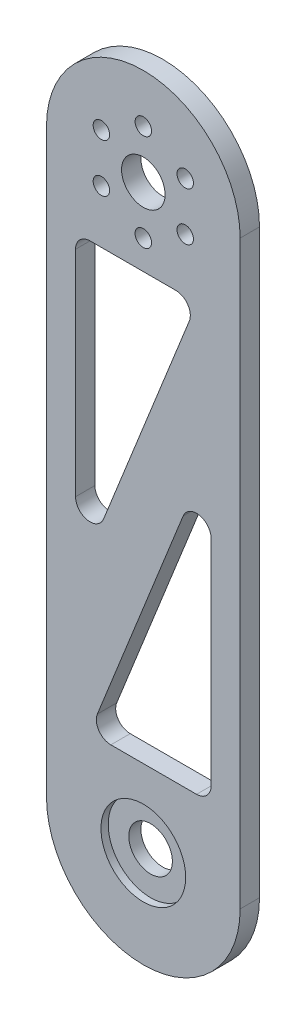
ISO-10303-21;
HEADER;
FILE_DESCRIPTION(('STEP AP214'),'2;1');
FILE_NAME('part.step','',(''),(''),'','','');
FILE_SCHEMA(('AUTOMOTIVE_DESIGN { 1 0 10303 214 1 1 1 1 }'));
ENDSEC;
DATA;
#1=APPLICATION_CONTEXT('core data for automotive mechanical design processes');
#2=APPLICATION_PROTOCOL_DEFINITION('international standard','automotive_design',2000,#1);
#3=PRODUCT_CONTEXT('',#1,'mechanical');
#4=PRODUCT('Part','Part','',(#3));
#5=PRODUCT_RELATED_PRODUCT_CATEGORY('part','',(#4));
#6=PRODUCT_DEFINITION_FORMATION('','',#4);
#7=PRODUCT_DEFINITION_CONTEXT('part definition',#1,'design');
#8=PRODUCT_DEFINITION('design','',#6,#7);
#9=PRODUCT_DEFINITION_SHAPE('','',#8);
#10=(LENGTH_UNIT() NAMED_UNIT(*) SI_UNIT(.MILLI.,.METRE.));
#11=(NAMED_UNIT(*) PLANE_ANGLE_UNIT() SI_UNIT($,.RADIAN.));
#12=(NAMED_UNIT(*) SI_UNIT($,.STERADIAN.) SOLID_ANGLE_UNIT());
#13=UNCERTAINTY_MEASURE_WITH_UNIT(LENGTH_MEASURE(1.E-05),#10,'distance_accuracy_value','');
#14=(GEOMETRIC_REPRESENTATION_CONTEXT(3) GLOBAL_UNCERTAINTY_ASSIGNED_CONTEXT((#13)) GLOBAL_UNIT_ASSIGNED_CONTEXT((#10,
#11,#12)) REPRESENTATION_CONTEXT('',''));
#15=CARTESIAN_POINT('',(0.,0.,0.));
#16=DIRECTION('',(0.,0.,1.));
#17=DIRECTION('',(1.,0.,0.));
#18=AXIS2_PLACEMENT_3D('',#15,#16,#17);
#19=CARTESIAN_POINT('',(0.,-60.,4.));
#20=DIRECTION('',(0.,0.,-1.));
#21=DIRECTION('',(-1.,0.,0.));
#22=AXIS2_PLACEMENT_3D('',#19,#20,#21);
#23=CYLINDRICAL_SURFACE('',#22,4.5);
#24=CARTESIAN_POINT('',(0.,-60.,0.));
#25=DIRECTION('',(0.,0.,1.));
#26=DIRECTION('',(1.,0.,0.));
#27=AXIS2_PLACEMENT_3D('',#24,#25,#26);
#28=CIRCLE('',#27,4.5);
#29=CARTESIAN_POINT('',(4.5,-60.,0.));
#30=VERTEX_POINT('',#29);
#31=EDGE_CURVE('E269',#30,#30,#28,.T.);
#32=ORIENTED_EDGE('',*,*,#31,.F.);
#33=EDGE_LOOP('',(#32));
#34=FACE_BOUND('',#33,.T.);
#35=CARTESIAN_POINT('',(0.,-60.,2.5));
#36=DIRECTION('',(0.,0.,1.));
#37=DIRECTION('',(1.,0.,0.));
#38=AXIS2_PLACEMENT_3D('',#35,#36,#37);
#39=CIRCLE('',#38,4.5);
#40=CARTESIAN_POINT('',(4.5,-60.,2.5));
#41=VERTEX_POINT('',#40);
#42=EDGE_CURVE('E40',#41,#41,#39,.T.);
#43=ORIENTED_EDGE('',*,*,#42,.T.);
#44=EDGE_LOOP('',(#43));
#45=FACE_BOUND('',#44,.T.);
#46=ADVANCED_FACE('F36',(#34,#45),#23,.F.);
#47=CARTESIAN_POINT('',(0.,-60.,4.));
#48=DIRECTION('',(0.,0.,1.));
#49=DIRECTION('',(1.,0.,0.));
#50=AXIS2_PLACEMENT_3D('',#47,#48,#49);
#51=PLANE('',#50);
#52=CARTESIAN_POINT('',(0.,-60.,4.));
#53=DIRECTION('',(0.,0.,1.));
#54=DIRECTION('',(1.,0.,0.));
#55=AXIS2_PLACEMENT_3D('',#52,#53,#54);
#56=CIRCLE('',#55,8.75);
#57=CARTESIAN_POINT('',(8.75,-60.,4.));
#58=VERTEX_POINT('',#57);
#59=EDGE_CURVE('E400',#58,#58,#56,.T.);
#60=ORIENTED_EDGE('',*,*,#59,.F.);
#61=EDGE_LOOP('',(#60));
#62=FACE_BOUND('',#61,.T.);
#63=CARTESIAN_POINT('',(0.,50.,4.));
#64=DIRECTION('',(0.,0.,1.));
#65=DIRECTION('',(1.,0.,0.));
#66=AXIS2_PLACEMENT_3D('',#63,#64,#65);
#67=CIRCLE('',#66,1.7);
#68=CARTESIAN_POINT('',(1.7,50.,4.));
#69=VERTEX_POINT('',#68);
#70=EDGE_CURVE('E392',#69,#69,#67,.T.);
#71=ORIENTED_EDGE('',*,*,#70,.F.);
#72=EDGE_LOOP('',(#71));
#73=FACE_BOUND('',#72,.T.);
#74=CARTESIAN_POINT('',(8.66025403784415,55.,4.));
#75=DIRECTION('',(0.,0.,1.));
#76=DIRECTION('',(1.,0.,0.));
#77=AXIS2_PLACEMENT_3D('',#74,#75,#76);
#78=CIRCLE('',#77,1.69999999999993);
#79=CARTESIAN_POINT('',(10.3602540378441,55.,4.));
#80=VERTEX_POINT('',#79);
#81=EDGE_CURVE('E393',#80,#80,#78,.T.);
#82=ORIENTED_EDGE('',*,*,#81,.F.);
#83=EDGE_LOOP('',(#82));
#84=FACE_BOUND('',#83,.T.);
#85=CARTESIAN_POINT('',(8.66025403784442,64.9999999999999,4.));
#86=DIRECTION('',(0.,0.,1.));
#87=DIRECTION('',(1.,0.,0.));
#88=AXIS2_PLACEMENT_3D('',#85,#86,#87);
#89=CIRCLE('',#88,1.69999999999999);
#90=CARTESIAN_POINT('',(10.3602540378444,64.9999999999999,4.));
#91=VERTEX_POINT('',#90);
#92=EDGE_CURVE('E376',#91,#91,#89,.T.);
#93=ORIENTED_EDGE('',*,*,#92,.F.);
#94=EDGE_LOOP('',(#93));
#95=FACE_BOUND('',#94,.T.);
#96=CARTESIAN_POINT('',(0.,70.,4.));
#97=DIRECTION('',(0.,0.,1.));
#98=DIRECTION('',(1.,0.,0.));
#99=AXIS2_PLACEMENT_3D('',#96,#97,#98);
#100=CIRCLE('',#99,1.7);
#101=CARTESIAN_POINT('',(1.70000000000007,70.,4.));
#102=VERTEX_POINT('',#101);
#103=EDGE_CURVE('E380',#102,#102,#100,.T.);
#104=ORIENTED_EDGE('',*,*,#103,.F.);
#105=EDGE_LOOP('',(#104));
#106=FACE_BOUND('',#105,.T.);
#107=CARTESIAN_POINT('',(-8.66025403784437,65.,4.));
#108=DIRECTION('',(0.,0.,1.));
#109=DIRECTION('',(1.,0.,0.));
#110=AXIS2_PLACEMENT_3D('',#107,#108,#109);
#111=CIRCLE('',#110,1.7);
#112=CARTESIAN_POINT('',(-6.96025403784436,65.,4.));
#113=VERTEX_POINT('',#112);
#114=EDGE_CURVE('E384',#113,#113,#111,.T.);
#115=ORIENTED_EDGE('',*,*,#114,.F.);
#116=EDGE_LOOP('',(#115));
#117=FACE_BOUND('',#116,.T.);
#118=CARTESIAN_POINT('',(-8.66025403784427,54.9999999999998,4.));
#119=DIRECTION('',(0.,0.,1.));
#120=DIRECTION('',(1.,0.,0.));
#121=AXIS2_PLACEMENT_3D('',#118,#119,#120);
#122=CIRCLE('',#121,1.69999999999974);
#123=CARTESIAN_POINT('',(-6.96025403784454,54.9999999999998,4.));
#124=VERTEX_POINT('',#123);
#125=EDGE_CURVE('E388',#124,#124,#122,.T.);
#126=ORIENTED_EDGE('',*,*,#125,.F.);
#127=EDGE_LOOP('',(#126));
#128=FACE_BOUND('',#127,.T.);
#129=DIRECTION('',(1.,0.,0.));
#130=VECTOR('',#129,1.);
#131=CARTESIAN_POINT('',(-11.1378022314386,-44.,4.));
#132=LINE('',#131,#130);
#133=CARTESIAN_POINT('',(-6.70670334715789,-44.,4.));
#134=VERTEX_POINT('',#133);
#135=CARTESIAN_POINT('',(11.,-44.,4.));
#136=VERTEX_POINT('',#135);
#137=EDGE_CURVE('E371',#134,#136,#132,.T.);
#138=ORIENTED_EDGE('',*,*,#137,.F.);
#139=CARTESIAN_POINT('',(-6.70670334715789,-41.,4.));
#140=DIRECTION('',(0.,0.,1.));
#141=DIRECTION('',(1.,0.,0.));
#142=AXIS2_PLACEMENT_3D('',#139,#140,#141);
#143=CIRCLE('',#142,3.);
#144=CARTESIAN_POINT('',(-9.49213341981367,-39.8858279709377,4.));
#145=VERTEX_POINT('',#144);
#146=EDGE_CURVE('E219',#134,#145,#143,.F.);
#147=ORIENTED_EDGE('',*,*,#146,.T.);
#148=DIRECTION('',(-0.371390676354104,-0.928476690885259,0.));
#149=VECTOR('',#148,1.);
#150=CARTESIAN_POINT('',(-11.1378022314386,-44.,4.));
#151=LINE('',#150,#149);
#152=CARTESIAN_POINT('',(8.21456992734423,4.38093039695704,4.));
#153=VERTEX_POINT('',#152);
#154=EDGE_CURVE('E257',#153,#145,#151,.T.);
#155=ORIENTED_EDGE('',*,*,#154,.F.);
#156=CARTESIAN_POINT('',(11.,3.26675836789472,4.));
#157=DIRECTION('',(0.,0.,1.));
#158=DIRECTION('',(1.,0.,0.));
#159=AXIS2_PLACEMENT_3D('',#156,#157,#158);
#160=CIRCLE('',#159,3.);
#161=CARTESIAN_POINT('',(14.,3.26675836789472,4.));
#162=VERTEX_POINT('',#161);
#163=EDGE_CURVE('E211',#153,#162,#160,.F.);
#164=ORIENTED_EDGE('',*,*,#163,.T.);
#165=DIRECTION('',(0.,1.,0.));
#166=VECTOR('',#165,1.);
#167=CARTESIAN_POINT('',(14.,-44.,4.));
#168=LINE('',#167,#166);
#169=CARTESIAN_POINT('',(14.,-41.,4.));
#170=VERTEX_POINT('',#169);
#171=EDGE_CURVE('E369',#170,#162,#168,.T.);
#172=ORIENTED_EDGE('',*,*,#171,.F.);
#173=CARTESIAN_POINT('',(11.,-41.,4.));
#174=DIRECTION('',(0.,0.,1.));
#175=DIRECTION('',(1.,0.,0.));
#176=AXIS2_PLACEMENT_3D('',#173,#174,#175);
#177=CIRCLE('',#176,3.);
#178=EDGE_CURVE('E215',#170,#136,#177,.F.);
#179=ORIENTED_EDGE('',*,*,#178,.T.);
#180=EDGE_LOOP('',(#138,#147,#155,#164,#172,#179));
#181=FACE_BOUND('',#180,.T.);
#182=DIRECTION('',(0.,-1.,0.));
#183=VECTOR('',#182,1.);
#184=CARTESIAN_POINT('',(-14.,-18.8445055785965,4.));
#185=LINE('',#184,#183);
#186=CARTESIAN_POINT('',(-14.,41.,4.));
#187=VERTEX_POINT('',#186);
#188=CARTESIAN_POINT('',(-14.,-3.26675836789474,4.));
#189=VERTEX_POINT('',#188);
#190=EDGE_CURVE('E235',#187,#189,#185,.T.);
#191=ORIENTED_EDGE('',*,*,#190,.F.);
#192=CARTESIAN_POINT('',(-11.,41.,4.));
#193=DIRECTION('',(0.,0.,1.));
#194=DIRECTION('',(1.,0.,0.));
#195=AXIS2_PLACEMENT_3D('',#192,#193,#194);
#196=CIRCLE('',#195,3.);
#197=CARTESIAN_POINT('',(-11.,44.,4.));
#198=VERTEX_POINT('',#197);
#199=EDGE_CURVE('E45',#187,#198,#196,.F.);
#200=ORIENTED_EDGE('',*,*,#199,.T.);
#201=DIRECTION('',(-1.,0.,0.));
#202=VECTOR('',#201,1.);
#203=CARTESIAN_POINT('',(-14.,44.,4.));
#204=LINE('',#203,#202);
#205=CARTESIAN_POINT('',(6.7067033471579,44.,4.));
#206=VERTEX_POINT('',#205);
#207=EDGE_CURVE('E233',#206,#198,#204,.T.);
#208=ORIENTED_EDGE('',*,*,#207,.F.);
#209=CARTESIAN_POINT('',(6.7067033471579,41.,4.));
#210=DIRECTION('',(0.,0.,1.));
#211=DIRECTION('',(1.,0.,0.));
#212=AXIS2_PLACEMENT_3D('',#209,#210,#211);
#213=CIRCLE('',#212,3.);
#214=CARTESIAN_POINT('',(9.49213341981367,39.8858279709377,4.));
#215=VERTEX_POINT('',#214);
#216=EDGE_CURVE('E227',#206,#215,#213,.F.);
#217=ORIENTED_EDGE('',*,*,#216,.T.);
#218=DIRECTION('',(0.371390676354104,0.928476690885259,0.));
#219=VECTOR('',#218,1.);
#220=CARTESIAN_POINT('',(-14.,-18.8445055785965,4.));
#221=LINE('',#220,#219);
#222=CARTESIAN_POINT('',(-8.21456992734422,-4.38093039695705,4.));
#223=VERTEX_POINT('',#222);
#224=EDGE_CURVE('E241',#223,#215,#221,.T.);
#225=ORIENTED_EDGE('',*,*,#224,.F.);
#226=CARTESIAN_POINT('',(-11.,-3.26675836789474,4.));
#227=DIRECTION('',(0.,0.,1.));
#228=DIRECTION('',(1.,0.,0.));
#229=AXIS2_PLACEMENT_3D('',#226,#227,#228);
#230=CIRCLE('',#229,3.);
#231=EDGE_CURVE('E223',#223,#189,#230,.F.);
#232=ORIENTED_EDGE('',*,*,#231,.T.);
#233=EDGE_LOOP('',(#191,#200,#208,#217,#225,#232));
#234=FACE_BOUND('',#233,.T.);
#235=CARTESIAN_POINT('',(0.,-60.,4.));
#236=DIRECTION('',(0.,0.,1.));
#237=DIRECTION('',(1.,0.,0.));
#238=AXIS2_PLACEMENT_3D('',#235,#236,#237);
#239=CIRCLE('',#238,20.);
#240=CARTESIAN_POINT('',(-20.,-60.,4.));
#241=VERTEX_POINT('',#240);
#242=CARTESIAN_POINT('',(20.,-60.,4.));
#243=VERTEX_POINT('',#242);
#244=EDGE_CURVE('E162',#241,#243,#239,.T.);
#245=ORIENTED_EDGE('',*,*,#244,.T.);
#246=DIRECTION('',(0.,1.,0.));
#247=VECTOR('',#246,1.);
#248=CARTESIAN_POINT('',(20.,-60.,4.));
#249=LINE('',#248,#247);
#250=CARTESIAN_POINT('',(20.,60.,4.));
#251=VERTEX_POINT('',#250);
#252=EDGE_CURVE('E151',#243,#251,#249,.T.);
#253=ORIENTED_EDGE('',*,*,#252,.T.);
#254=CARTESIAN_POINT('',(0.,60.,4.));
#255=DIRECTION('',(0.,0.,1.));
#256=DIRECTION('',(1.,0.,0.));
#257=AXIS2_PLACEMENT_3D('',#254,#255,#256);
#258=CIRCLE('',#257,20.);
#259=CARTESIAN_POINT('',(-20.,60.,4.));
#260=VERTEX_POINT('',#259);
#261=EDGE_CURVE('E161',#251,#260,#258,.T.);
#262=ORIENTED_EDGE('',*,*,#261,.T.);
#263=DIRECTION('',(0.,-1.,0.));
#264=VECTOR('',#263,1.);
#265=CARTESIAN_POINT('',(-20.,60.,4.));
#266=LINE('',#265,#264);
#267=EDGE_CURVE('E168',#260,#241,#266,.T.);
#268=ORIENTED_EDGE('',*,*,#267,.T.);
#269=EDGE_LOOP('',(#245,#253,#262,#268));
#270=FACE_BOUND('',#269,.T.);
#271=CARTESIAN_POINT('',(0.,60.,4.));
#272=DIRECTION('',(0.,0.,1.));
#273=DIRECTION('',(1.,0.,0.));
#274=AXIS2_PLACEMENT_3D('',#271,#272,#273);
#275=CIRCLE('',#274,4.5);
#276=CARTESIAN_POINT('',(4.5,60.,4.));
#277=VERTEX_POINT('',#276);
#278=EDGE_CURVE('E266',#277,#277,#275,.T.);
#279=ORIENTED_EDGE('',*,*,#278,.F.);
#280=EDGE_LOOP('',(#279));
#281=FACE_BOUND('',#280,.T.);
#282=ADVANCED_FACE('F165',(#62,#73,#84,#95,#106,#117,#128,#181,#234,#270,#281),#51,.T.);
#283=CARTESIAN_POINT('',(0.,-60.,0.));
#284=DIRECTION('',(0.,0.,1.));
#285=DIRECTION('',(1.,0.,0.));
#286=AXIS2_PLACEMENT_3D('',#283,#284,#285);
#287=PLANE('',#286);
#288=CARTESIAN_POINT('',(0.,50.,0.));
#289=DIRECTION('',(0.,0.,1.));
#290=DIRECTION('',(1.,0.,0.));
#291=AXIS2_PLACEMENT_3D('',#288,#289,#290);
#292=CIRCLE('',#291,1.7);
#293=CARTESIAN_POINT('',(1.7,50.,0.));
#294=VERTEX_POINT('',#293);
#295=EDGE_CURVE('E323',#294,#294,#292,.T.);
#296=ORIENTED_EDGE('',*,*,#295,.T.);
#297=EDGE_LOOP('',(#296));
#298=FACE_BOUND('',#297,.T.);
#299=CARTESIAN_POINT('',(8.66025403784415,55.,0.));
#300=DIRECTION('',(0.,0.,1.));
#301=DIRECTION('',(1.,0.,0.));
#302=AXIS2_PLACEMENT_3D('',#299,#300,#301);
#303=CIRCLE('',#302,1.69999999999993);
#304=CARTESIAN_POINT('',(10.3602540378441,55.,0.));
#305=VERTEX_POINT('',#304);
#306=EDGE_CURVE('E327',#305,#305,#303,.T.);
#307=ORIENTED_EDGE('',*,*,#306,.T.);
#308=EDGE_LOOP('',(#307));
#309=FACE_BOUND('',#308,.T.);
#310=CARTESIAN_POINT('',(8.66025403784442,64.9999999999999,0.));
#311=DIRECTION('',(0.,0.,1.));
#312=DIRECTION('',(1.,0.,0.));
#313=AXIS2_PLACEMENT_3D('',#310,#311,#312);
#314=CIRCLE('',#313,1.69999999999999);
#315=CARTESIAN_POINT('',(10.3602540378444,64.9999999999999,0.));
#316=VERTEX_POINT('',#315);
#317=EDGE_CURVE('E331',#316,#316,#314,.T.);
#318=ORIENTED_EDGE('',*,*,#317,.T.);
#319=EDGE_LOOP('',(#318));
#320=FACE_BOUND('',#319,.T.);
#321=CARTESIAN_POINT('',(0.,70.,0.));
#322=DIRECTION('',(0.,0.,1.));
#323=DIRECTION('',(1.,0.,0.));
#324=AXIS2_PLACEMENT_3D('',#321,#322,#323);
#325=CIRCLE('',#324,1.7);
#326=CARTESIAN_POINT('',(1.70000000000007,70.,0.));
#327=VERTEX_POINT('',#326);
#328=EDGE_CURVE('E335',#327,#327,#325,.T.);
#329=ORIENTED_EDGE('',*,*,#328,.T.);
#330=EDGE_LOOP('',(#329));
#331=FACE_BOUND('',#330,.T.);
#332=CARTESIAN_POINT('',(-8.66025403784437,65.,0.));
#333=DIRECTION('',(0.,0.,1.));
#334=DIRECTION('',(1.,0.,0.));
#335=AXIS2_PLACEMENT_3D('',#332,#333,#334);
#336=CIRCLE('',#335,1.7);
#337=CARTESIAN_POINT('',(-6.96025403784436,65.,0.));
#338=VERTEX_POINT('',#337);
#339=EDGE_CURVE('E339',#338,#338,#336,.T.);
#340=ORIENTED_EDGE('',*,*,#339,.T.);
#341=EDGE_LOOP('',(#340));
#342=FACE_BOUND('',#341,.T.);
#343=CARTESIAN_POINT('',(-8.66025403784427,54.9999999999998,0.));
#344=DIRECTION('',(0.,0.,1.));
#345=DIRECTION('',(1.,0.,0.));
#346=AXIS2_PLACEMENT_3D('',#343,#344,#345);
#347=CIRCLE('',#346,1.69999999999974);
#348=CARTESIAN_POINT('',(-6.96025403784454,54.9999999999998,0.));
#349=VERTEX_POINT('',#348);
#350=EDGE_CURVE('E343',#349,#349,#347,.T.);
#351=ORIENTED_EDGE('',*,*,#350,.T.);
#352=EDGE_LOOP('',(#351));
#353=FACE_BOUND('',#352,.T.);
#354=DIRECTION('',(0.,1.,0.));
#355=VECTOR('',#354,1.);
#356=CARTESIAN_POINT('',(14.,-44.,0.));
#357=LINE('',#356,#355);
#358=CARTESIAN_POINT('',(14.,-41.,0.));
#359=VERTEX_POINT('',#358);
#360=CARTESIAN_POINT('',(14.,3.26675836789472,0.));
#361=VERTEX_POINT('',#360);
#362=EDGE_CURVE('E346',#359,#361,#357,.T.);
#363=ORIENTED_EDGE('',*,*,#362,.T.);
#364=CARTESIAN_POINT('',(11.,3.26675836789472,0.));
#365=DIRECTION('',(0.,0.,1.));
#366=DIRECTION('',(1.,0.,0.));
#367=AXIS2_PLACEMENT_3D('',#364,#365,#366);
#368=CIRCLE('',#367,3.);
#369=CARTESIAN_POINT('',(8.21456992734423,4.38093039695704,0.));
#370=VERTEX_POINT('',#369);
#371=EDGE_CURVE('E213',#361,#370,#368,.T.);
#372=ORIENTED_EDGE('',*,*,#371,.T.);
#373=DIRECTION('',(-0.371390676354104,-0.928476690885259,0.));
#374=VECTOR('',#373,1.);
#375=CARTESIAN_POINT('',(-11.1378022314386,-44.,0.));
#376=LINE('',#375,#374);
#377=CARTESIAN_POINT('',(-9.49213341981367,-39.8858279709377,0.));
#378=VERTEX_POINT('',#377);
#379=EDGE_CURVE('E263',#370,#378,#376,.T.);
#380=ORIENTED_EDGE('',*,*,#379,.T.);
#381=CARTESIAN_POINT('',(-6.70670334715789,-41.,0.));
#382=DIRECTION('',(0.,0.,1.));
#383=DIRECTION('',(1.,0.,0.));
#384=AXIS2_PLACEMENT_3D('',#381,#382,#383);
#385=CIRCLE('',#384,3.);
#386=CARTESIAN_POINT('',(-6.70670334715789,-44.,0.));
#387=VERTEX_POINT('',#386);
#388=EDGE_CURVE('E221',#378,#387,#385,.T.);
#389=ORIENTED_EDGE('',*,*,#388,.T.);
#390=DIRECTION('',(1.,0.,0.));
#391=VECTOR('',#390,1.);
#392=CARTESIAN_POINT('',(-11.1378022314386,-44.,0.));
#393=LINE('',#392,#391);
#394=CARTESIAN_POINT('',(11.,-44.,0.));
#395=VERTEX_POINT('',#394);
#396=EDGE_CURVE('E354',#387,#395,#393,.T.);
#397=ORIENTED_EDGE('',*,*,#396,.T.);
#398=CARTESIAN_POINT('',(11.,-41.,0.));
#399=DIRECTION('',(0.,0.,1.));
#400=DIRECTION('',(1.,0.,0.));
#401=AXIS2_PLACEMENT_3D('',#398,#399,#400);
#402=CIRCLE('',#401,3.);
#403=EDGE_CURVE('E217',#395,#359,#402,.T.);
#404=ORIENTED_EDGE('',*,*,#403,.T.);
#405=EDGE_LOOP('',(#363,#372,#380,#389,#397,#404));
#406=FACE_BOUND('',#405,.T.);
#407=DIRECTION('',(0.371390676354104,0.928476690885259,0.));
#408=VECTOR('',#407,1.);
#409=CARTESIAN_POINT('',(-14.,-18.8445055785965,0.));
#410=LINE('',#409,#408);
#411=CARTESIAN_POINT('',(-8.21456992734422,-4.38093039695705,0.));
#412=VERTEX_POINT('',#411);
#413=CARTESIAN_POINT('',(9.49213341981367,39.8858279709377,0.));
#414=VERTEX_POINT('',#413);
#415=EDGE_CURVE('E253',#412,#414,#410,.T.);
#416=ORIENTED_EDGE('',*,*,#415,.T.);
#417=CARTESIAN_POINT('',(6.7067033471579,41.,0.));
#418=DIRECTION('',(0.,0.,1.));
#419=DIRECTION('',(1.,0.,0.));
#420=AXIS2_PLACEMENT_3D('',#417,#418,#419);
#421=CIRCLE('',#420,3.);
#422=CARTESIAN_POINT('',(6.7067033471579,44.,0.));
#423=VERTEX_POINT('',#422);
#424=EDGE_CURVE('E59',#414,#423,#421,.T.);
#425=ORIENTED_EDGE('',*,*,#424,.T.);
#426=DIRECTION('',(-1.,0.,0.));
#427=VECTOR('',#426,1.);
#428=CARTESIAN_POINT('',(-14.,44.,0.));
#429=LINE('',#428,#427);
#430=CARTESIAN_POINT('',(-11.,44.,0.));
#431=VERTEX_POINT('',#430);
#432=EDGE_CURVE('E249',#423,#431,#429,.T.);
#433=ORIENTED_EDGE('',*,*,#432,.T.);
#434=CARTESIAN_POINT('',(-11.,41.,0.));
#435=DIRECTION('',(0.,0.,1.));
#436=DIRECTION('',(1.,0.,0.));
#437=AXIS2_PLACEMENT_3D('',#434,#435,#436);
#438=CIRCLE('',#437,3.);
#439=CARTESIAN_POINT('',(-14.,41.,0.));
#440=VERTEX_POINT('',#439);
#441=EDGE_CURVE('E11',#431,#440,#438,.T.);
#442=ORIENTED_EDGE('',*,*,#441,.T.);
#443=DIRECTION('',(0.,-1.,0.));
#444=VECTOR('',#443,1.);
#445=CARTESIAN_POINT('',(-14.,-18.8445055785965,0.));
#446=LINE('',#445,#444);
#447=CARTESIAN_POINT('',(-14.,-3.26675836789474,0.));
#448=VERTEX_POINT('',#447);
#449=EDGE_CURVE('E240',#440,#448,#446,.T.);
#450=ORIENTED_EDGE('',*,*,#449,.T.);
#451=CARTESIAN_POINT('',(-11.,-3.26675836789474,0.));
#452=DIRECTION('',(0.,0.,1.));
#453=DIRECTION('',(1.,0.,0.));
#454=AXIS2_PLACEMENT_3D('',#451,#452,#453);
#455=CIRCLE('',#454,3.);
#456=EDGE_CURVE('E225',#448,#412,#455,.T.);
#457=ORIENTED_EDGE('',*,*,#456,.T.);
#458=EDGE_LOOP('',(#416,#425,#433,#442,#450,#457));
#459=FACE_BOUND('',#458,.T.);
#460=CARTESIAN_POINT('',(0.,-60.,0.));
#461=DIRECTION('',(0.,0.,1.));
#462=DIRECTION('',(1.,0.,0.));
#463=AXIS2_PLACEMENT_3D('',#460,#461,#462);
#464=CIRCLE('',#463,20.);
#465=CARTESIAN_POINT('',(-20.,-60.,0.));
#466=VERTEX_POINT('',#465);
#467=CARTESIAN_POINT('',(20.,-60.,0.));
#468=VERTEX_POINT('',#467);
#469=EDGE_CURVE('E176',#466,#468,#464,.T.);
#470=ORIENTED_EDGE('',*,*,#469,.F.);
#471=DIRECTION('',(0.,-1.,0.));
#472=VECTOR('',#471,1.);
#473=CARTESIAN_POINT('',(-20.,60.,0.));
#474=LINE('',#473,#472);
#475=CARTESIAN_POINT('',(-20.,60.,0.));
#476=VERTEX_POINT('',#475);
#477=EDGE_CURVE('E172',#476,#466,#474,.T.);
#478=ORIENTED_EDGE('',*,*,#477,.F.);
#479=CARTESIAN_POINT('',(0.,60.,0.));
#480=DIRECTION('',(0.,0.,1.));
#481=DIRECTION('',(1.,0.,0.));
#482=AXIS2_PLACEMENT_3D('',#479,#480,#481);
#483=CIRCLE('',#482,20.);
#484=CARTESIAN_POINT('',(20.,60.,0.));
#485=VERTEX_POINT('',#484);
#486=EDGE_CURVE('E280',#485,#476,#483,.T.);
#487=ORIENTED_EDGE('',*,*,#486,.F.);
#488=DIRECTION('',(0.,1.,0.));
#489=VECTOR('',#488,1.);
#490=CARTESIAN_POINT('',(20.,-60.,0.));
#491=LINE('',#490,#489);
#492=EDGE_CURVE('E278',#468,#485,#491,.T.);
#493=ORIENTED_EDGE('',*,*,#492,.F.);
#494=EDGE_LOOP('',(#470,#478,#487,#493));
#495=FACE_BOUND('',#494,.T.);
#496=ORIENTED_EDGE('',*,*,#31,.T.);
#497=EDGE_LOOP('',(#496));
#498=FACE_BOUND('',#497,.T.);
#499=CARTESIAN_POINT('',(0.,60.,0.));
#500=DIRECTION('',(0.,0.,1.));
#501=DIRECTION('',(1.,0.,0.));
#502=AXIS2_PLACEMENT_3D('',#499,#500,#501);
#503=CIRCLE('',#502,4.5);
#504=CARTESIAN_POINT('',(4.5,60.,0.));
#505=VERTEX_POINT('',#504);
#506=EDGE_CURVE('E261',#505,#505,#503,.T.);
#507=ORIENTED_EDGE('',*,*,#506,.T.);
#508=EDGE_LOOP('',(#507));
#509=FACE_BOUND('',#508,.T.);
#510=ADVANCED_FACE('F246',(#298,#309,#320,#331,#342,#353,#406,#459,#495,#498,#509),#287,.F.);
#511=CARTESIAN_POINT('',(0.,-60.,4.));
#512=DIRECTION('',(0.,0.,-1.));
#513=DIRECTION('',(-1.,0.,0.));
#514=AXIS2_PLACEMENT_3D('',#511,#512,#513);
#515=CYLINDRICAL_SURFACE('',#514,20.);
#516=ORIENTED_EDGE('',*,*,#469,.T.);
#517=DIRECTION('',(0.,0.,-1.));
#518=VECTOR('',#517,1.);
#519=CARTESIAN_POINT('',(20.,-60.,4.));
#520=LINE('',#519,#518);
#521=EDGE_CURVE('E155',#243,#468,#520,.T.);
#522=ORIENTED_EDGE('',*,*,#521,.F.);
#523=ORIENTED_EDGE('',*,*,#244,.F.);
#524=DIRECTION('',(0.,0.,-1.));
#525=VECTOR('',#524,1.);
#526=CARTESIAN_POINT('',(-20.,-60.,4.));
#527=LINE('',#526,#525);
#528=EDGE_CURVE('E276',#241,#466,#527,.T.);
#529=ORIENTED_EDGE('',*,*,#528,.T.);
#530=EDGE_LOOP('',(#516,#522,#523,#529));
#531=FACE_BOUND('',#530,.T.);
#532=ADVANCED_FACE('F174',(#531),#515,.T.);
#533=CARTESIAN_POINT('',(20.,-60.,4.));
#534=DIRECTION('',(-1.,0.,0.));
#535=DIRECTION('',(0.,-1.,0.));
#536=AXIS2_PLACEMENT_3D('',#533,#534,#535);
#537=PLANE('',#536);
#538=ORIENTED_EDGE('',*,*,#492,.T.);
#539=DIRECTION('',(0.,0.,-1.));
#540=VECTOR('',#539,1.);
#541=CARTESIAN_POINT('',(20.,60.,4.));
#542=LINE('',#541,#540);
#543=EDGE_CURVE('E158',#251,#485,#542,.T.);
#544=ORIENTED_EDGE('',*,*,#543,.F.);
#545=ORIENTED_EDGE('',*,*,#252,.F.);
#546=ORIENTED_EDGE('',*,*,#521,.T.);
#547=EDGE_LOOP('',(#538,#544,#545,#546));
#548=FACE_BOUND('',#547,.T.);
#549=ADVANCED_FACE('F153',(#548),#537,.F.);
#550=CARTESIAN_POINT('',(0.,60.,4.));
#551=DIRECTION('',(0.,0.,-1.));
#552=DIRECTION('',(-1.,0.,0.));
#553=AXIS2_PLACEMENT_3D('',#550,#551,#552);
#554=CYLINDRICAL_SURFACE('',#553,20.);
#555=ORIENTED_EDGE('',*,*,#486,.T.);
#556=DIRECTION('',(0.,0.,-1.));
#557=VECTOR('',#556,1.);
#558=CARTESIAN_POINT('',(-20.,60.,4.));
#559=LINE('',#558,#557);
#560=EDGE_CURVE('E181',#260,#476,#559,.T.);
#561=ORIENTED_EDGE('',*,*,#560,.F.);
#562=ORIENTED_EDGE('',*,*,#261,.F.);
#563=ORIENTED_EDGE('',*,*,#543,.T.);
#564=EDGE_LOOP('',(#555,#561,#562,#563));
#565=FACE_BOUND('',#564,.T.);
#566=ADVANCED_FACE('F291',(#565),#554,.T.);
#567=CARTESIAN_POINT('',(-20.,60.,4.));
#568=DIRECTION('',(1.,0.,0.));
#569=DIRECTION('',(0.,1.,0.));
#570=AXIS2_PLACEMENT_3D('',#567,#568,#569);
#571=PLANE('',#570);
#572=ORIENTED_EDGE('',*,*,#477,.T.);
#573=ORIENTED_EDGE('',*,*,#528,.F.);
#574=ORIENTED_EDGE('',*,*,#267,.F.);
#575=ORIENTED_EDGE('',*,*,#560,.T.);
#576=EDGE_LOOP('',(#572,#573,#574,#575));
#577=FACE_BOUND('',#576,.T.);
#578=ADVANCED_FACE('F287',(#577),#571,.F.);
#579=CARTESIAN_POINT('',(0.,60.,4.));
#580=DIRECTION('',(0.,0.,-1.));
#581=DIRECTION('',(-1.,0.,0.));
#582=AXIS2_PLACEMENT_3D('',#579,#580,#581);
#583=CYLINDRICAL_SURFACE('',#582,4.5);
#584=ORIENTED_EDGE('',*,*,#278,.T.);
#585=EDGE_LOOP('',(#584));
#586=FACE_BOUND('',#585,.T.);
#587=ORIENTED_EDGE('',*,*,#506,.F.);
#588=EDGE_LOOP('',(#587));
#589=FACE_BOUND('',#588,.T.);
#590=ADVANCED_FACE('F298',(#586,#589),#583,.F.);
#591=CARTESIAN_POINT('',(-14.,-18.8445055785965,0.));
#592=DIRECTION('',(-1.,0.,0.));
#593=DIRECTION('',(0.,0.,1.));
#594=AXIS2_PLACEMENT_3D('',#591,#592,#593);
#595=PLANE('',#594);
#596=ORIENTED_EDGE('',*,*,#190,.T.);
#597=DIRECTION('',(0.,0.,1.));
#598=VECTOR('',#597,1.);
#599=CARTESIAN_POINT('',(-14.,-3.26675836789474,0.));
#600=LINE('',#599,#598);
#601=EDGE_CURVE('E205',#189,#448,#600,.F.);
#602=ORIENTED_EDGE('',*,*,#601,.T.);
#603=ORIENTED_EDGE('',*,*,#449,.F.);
#604=DIRECTION('',(0.,0.,1.));
#605=VECTOR('',#604,1.);
#606=CARTESIAN_POINT('',(-14.,41.,4.));
#607=LINE('',#606,#605);
#608=EDGE_CURVE('E202',#440,#187,#607,.T.);
#609=ORIENTED_EDGE('',*,*,#608,.T.);
#610=EDGE_LOOP('',(#596,#602,#603,#609));
#611=FACE_BOUND('',#610,.T.);
#612=ADVANCED_FACE('F251',(#611),#595,.F.);
#613=CARTESIAN_POINT('',(-14.,44.,0.));
#614=DIRECTION('',(0.,1.,0.));
#615=DIRECTION('',(-1.,0.,0.));
#616=AXIS2_PLACEMENT_3D('',#613,#614,#615);
#617=PLANE('',#616);
#618=ORIENTED_EDGE('',*,*,#432,.F.);
#619=DIRECTION('',(0.,0.,1.));
#620=VECTOR('',#619,1.);
#621=CARTESIAN_POINT('',(6.7067033471579,44.,4.));
#622=LINE('',#621,#620);
#623=EDGE_CURVE('E208',#423,#206,#622,.T.);
#624=ORIENTED_EDGE('',*,*,#623,.T.);
#625=ORIENTED_EDGE('',*,*,#207,.T.);
#626=DIRECTION('',(0.,0.,1.));
#627=VECTOR('',#626,1.);
#628=CARTESIAN_POINT('',(-11.,44.,0.));
#629=LINE('',#628,#627);
#630=EDGE_CURVE('E52',#198,#431,#629,.F.);
#631=ORIENTED_EDGE('',*,*,#630,.T.);
#632=EDGE_LOOP('',(#618,#624,#625,#631));
#633=FACE_BOUND('',#632,.T.);
#634=ADVANCED_FACE('F238',(#633),#617,.F.);
#635=CARTESIAN_POINT('',(-14.,-18.8445055785965,0.));
#636=DIRECTION('',(0.928476690885259,-0.371390676354104,0.));
#637=DIRECTION('',(0.371390676354104,0.928476690885259,0.));
#638=AXIS2_PLACEMENT_3D('',#635,#636,#637);
#639=PLANE('',#638);
#640=ORIENTED_EDGE('',*,*,#415,.F.);
#641=DIRECTION('',(0.,0.,1.));
#642=VECTOR('',#641,1.);
#643=CARTESIAN_POINT('',(-8.21456992734422,-4.38093039695705,4.));
#644=LINE('',#643,#642);
#645=EDGE_CURVE('E199',#412,#223,#644,.T.);
#646=ORIENTED_EDGE('',*,*,#645,.T.);
#647=ORIENTED_EDGE('',*,*,#224,.T.);
#648=DIRECTION('',(0.,0.,1.));
#649=VECTOR('',#648,1.);
#650=CARTESIAN_POINT('',(9.49213341981367,39.8858279709377,0.));
#651=LINE('',#650,#649);
#652=EDGE_CURVE('E197',#215,#414,#651,.F.);
#653=ORIENTED_EDGE('',*,*,#652,.T.);
#654=EDGE_LOOP('',(#640,#646,#647,#653));
#655=FACE_BOUND('',#654,.T.);
#656=ADVANCED_FACE('F452',(#655),#639,.F.);
#657=CARTESIAN_POINT('',(-11.1378022314386,-44.,0.));
#658=DIRECTION('',(0.,-1.,0.));
#659=DIRECTION('',(0.,0.,-1.));
#660=AXIS2_PLACEMENT_3D('',#657,#658,#659);
#661=PLANE('',#660);
#662=ORIENTED_EDGE('',*,*,#137,.T.);
#663=DIRECTION('',(0.,0.,1.));
#664=VECTOR('',#663,1.);
#665=CARTESIAN_POINT('',(11.,-44.,0.));
#666=LINE('',#665,#664);
#667=EDGE_CURVE('E195',#136,#395,#666,.F.);
#668=ORIENTED_EDGE('',*,*,#667,.T.);
#669=ORIENTED_EDGE('',*,*,#396,.F.);
#670=DIRECTION('',(0.,0.,1.));
#671=VECTOR('',#670,1.);
#672=CARTESIAN_POINT('',(-6.70670334715789,-44.,4.));
#673=LINE('',#672,#671);
#674=EDGE_CURVE('E192',#387,#134,#673,.T.);
#675=ORIENTED_EDGE('',*,*,#674,.T.);
#676=EDGE_LOOP('',(#662,#668,#669,#675));
#677=FACE_BOUND('',#676,.T.);
#678=ADVANCED_FACE('F447',(#677),#661,.F.);
#679=CARTESIAN_POINT('',(-11.1378022314386,-44.,0.));
#680=DIRECTION('',(-0.928476690885259,0.371390676354104,0.));
#681=DIRECTION('',(-0.371390676354104,-0.928476690885259,0.));
#682=AXIS2_PLACEMENT_3D('',#679,#680,#681);
#683=PLANE('',#682);
#684=ORIENTED_EDGE('',*,*,#379,.F.);
#685=DIRECTION('',(0.,0.,1.));
#686=VECTOR('',#685,1.);
#687=CARTESIAN_POINT('',(8.21456992734423,4.38093039695703,4.));
#688=LINE('',#687,#686);
#689=EDGE_CURVE('E179',#370,#153,#688,.T.);
#690=ORIENTED_EDGE('',*,*,#689,.T.);
#691=ORIENTED_EDGE('',*,*,#154,.T.);
#692=DIRECTION('',(0.,0.,1.));
#693=VECTOR('',#692,1.);
#694=CARTESIAN_POINT('',(-9.49213341981367,-39.8858279709377,0.));
#695=LINE('',#694,#693);
#696=EDGE_CURVE('E177',#145,#378,#695,.F.);
#697=ORIENTED_EDGE('',*,*,#696,.T.);
#698=EDGE_LOOP('',(#684,#690,#691,#697));
#699=FACE_BOUND('',#698,.T.);
#700=ADVANCED_FACE('F363',(#699),#683,.F.);
#701=CARTESIAN_POINT('',(14.,-44.,0.));
#702=DIRECTION('',(1.,0.,0.));
#703=DIRECTION('',(0.,0.,-1.));
#704=AXIS2_PLACEMENT_3D('',#701,#702,#703);
#705=PLANE('',#704);
#706=ORIENTED_EDGE('',*,*,#171,.T.);
#707=DIRECTION('',(0.,0.,1.));
#708=VECTOR('',#707,1.);
#709=CARTESIAN_POINT('',(14.,3.26675836789472,0.));
#710=LINE('',#709,#708);
#711=EDGE_CURVE('E190',#162,#361,#710,.F.);
#712=ORIENTED_EDGE('',*,*,#711,.T.);
#713=ORIENTED_EDGE('',*,*,#362,.F.);
#714=DIRECTION('',(0.,0.,1.));
#715=VECTOR('',#714,1.);
#716=CARTESIAN_POINT('',(14.,-41.,4.));
#717=LINE('',#716,#715);
#718=EDGE_CURVE('E187',#359,#170,#717,.T.);
#719=ORIENTED_EDGE('',*,*,#718,.T.);
#720=EDGE_LOOP('',(#706,#712,#713,#719));
#721=FACE_BOUND('',#720,.T.);
#722=ADVANCED_FACE('F446',(#721),#705,.F.);
#723=CARTESIAN_POINT('',(11.,3.26675836789472,0.));
#724=DIRECTION('',(0.,0.,-1.));
#725=DIRECTION('',(-1.,0.,0.));
#726=AXIS2_PLACEMENT_3D('',#723,#724,#725);
#727=CYLINDRICAL_SURFACE('',#726,3.);
#728=ORIENTED_EDGE('',*,*,#371,.F.);
#729=ORIENTED_EDGE('',*,*,#711,.F.);
#730=ORIENTED_EDGE('',*,*,#163,.F.);
#731=ORIENTED_EDGE('',*,*,#689,.F.);
#732=EDGE_LOOP('',(#728,#729,#730,#731));
#733=FACE_BOUND('',#732,.T.);
#734=ADVANCED_FACE('F359',(#733),#727,.F.);
#735=CARTESIAN_POINT('',(11.,-41.,0.));
#736=DIRECTION('',(0.,0.,-1.));
#737=DIRECTION('',(-1.,0.,0.));
#738=AXIS2_PLACEMENT_3D('',#735,#736,#737);
#739=CYLINDRICAL_SURFACE('',#738,3.);
#740=ORIENTED_EDGE('',*,*,#403,.F.);
#741=ORIENTED_EDGE('',*,*,#667,.F.);
#742=ORIENTED_EDGE('',*,*,#178,.F.);
#743=ORIENTED_EDGE('',*,*,#718,.F.);
#744=EDGE_LOOP('',(#740,#741,#742,#743));
#745=FACE_BOUND('',#744,.T.);
#746=ADVANCED_FACE('F564',(#745),#739,.F.);
#747=CARTESIAN_POINT('',(-6.70670334715789,-41.,0.));
#748=DIRECTION('',(0.,0.,-1.));
#749=DIRECTION('',(-1.,0.,0.));
#750=AXIS2_PLACEMENT_3D('',#747,#748,#749);
#751=CYLINDRICAL_SURFACE('',#750,3.);
#752=ORIENTED_EDGE('',*,*,#388,.F.);
#753=ORIENTED_EDGE('',*,*,#696,.F.);
#754=ORIENTED_EDGE('',*,*,#146,.F.);
#755=ORIENTED_EDGE('',*,*,#674,.F.);
#756=EDGE_LOOP('',(#752,#753,#754,#755));
#757=FACE_BOUND('',#756,.T.);
#758=ADVANCED_FACE('F556',(#757),#751,.F.);
#759=CARTESIAN_POINT('',(-11.,-3.26675836789474,0.));
#760=DIRECTION('',(0.,0.,-1.));
#761=DIRECTION('',(-1.,0.,0.));
#762=AXIS2_PLACEMENT_3D('',#759,#760,#761);
#763=CYLINDRICAL_SURFACE('',#762,3.);
#764=ORIENTED_EDGE('',*,*,#456,.F.);
#765=ORIENTED_EDGE('',*,*,#601,.F.);
#766=ORIENTED_EDGE('',*,*,#231,.F.);
#767=ORIENTED_EDGE('',*,*,#645,.F.);
#768=EDGE_LOOP('',(#764,#765,#766,#767));
#769=FACE_BOUND('',#768,.T.);
#770=ADVANCED_FACE('F549',(#769),#763,.F.);
#771=CARTESIAN_POINT('',(6.7067033471579,41.,0.));
#772=DIRECTION('',(0.,0.,-1.));
#773=DIRECTION('',(-1.,0.,0.));
#774=AXIS2_PLACEMENT_3D('',#771,#772,#773);
#775=CYLINDRICAL_SURFACE('',#774,3.);
#776=ORIENTED_EDGE('',*,*,#424,.F.);
#777=ORIENTED_EDGE('',*,*,#652,.F.);
#778=ORIENTED_EDGE('',*,*,#216,.F.);
#779=ORIENTED_EDGE('',*,*,#623,.F.);
#780=EDGE_LOOP('',(#776,#777,#778,#779));
#781=FACE_BOUND('',#780,.T.);
#782=ADVANCED_FACE('F543',(#781),#775,.F.);
#783=CARTESIAN_POINT('',(-11.,41.,0.));
#784=DIRECTION('',(0.,0.,-1.));
#785=DIRECTION('',(-1.,0.,0.));
#786=AXIS2_PLACEMENT_3D('',#783,#784,#785);
#787=CYLINDRICAL_SURFACE('',#786,3.);
#788=ORIENTED_EDGE('',*,*,#441,.F.);
#789=ORIENTED_EDGE('',*,*,#630,.F.);
#790=ORIENTED_EDGE('',*,*,#199,.F.);
#791=ORIENTED_EDGE('',*,*,#608,.F.);
#792=EDGE_LOOP('',(#788,#789,#790,#791));
#793=FACE_BOUND('',#792,.T.);
#794=ADVANCED_FACE('F38',(#793),#787,.F.);
#795=CARTESIAN_POINT('',(-8.66025403784427,54.9999999999998,0.));
#796=DIRECTION('',(0.,0.,1.));
#797=DIRECTION('',(1.,0.,0.));
#798=AXIS2_PLACEMENT_3D('',#795,#796,#797);
#799=CYLINDRICAL_SURFACE('',#798,1.69999999999974);
#800=ORIENTED_EDGE('',*,*,#350,.F.);
#801=EDGE_LOOP('',(#800));
#802=FACE_BOUND('',#801,.T.);
#803=ORIENTED_EDGE('',*,*,#125,.T.);
#804=EDGE_LOOP('',(#803));
#805=FACE_BOUND('',#804,.T.);
#806=ADVANCED_FACE('F429',(#802,#805),#799,.F.);
#807=CARTESIAN_POINT('',(-8.66025403784437,65.,0.));
#808=DIRECTION('',(0.,0.,1.));
#809=DIRECTION('',(1.,0.,0.));
#810=AXIS2_PLACEMENT_3D('',#807,#808,#809);
#811=CYLINDRICAL_SURFACE('',#810,1.7);
#812=ORIENTED_EDGE('',*,*,#339,.F.);
#813=EDGE_LOOP('',(#812));
#814=FACE_BOUND('',#813,.T.);
#815=ORIENTED_EDGE('',*,*,#114,.T.);
#816=EDGE_LOOP('',(#815));
#817=FACE_BOUND('',#816,.T.);
#818=ADVANCED_FACE('F432',(#814,#817),#811,.F.);
#819=CARTESIAN_POINT('',(0.,70.,0.));
#820=DIRECTION('',(0.,0.,1.));
#821=DIRECTION('',(1.,0.,0.));
#822=AXIS2_PLACEMENT_3D('',#819,#820,#821);
#823=CYLINDRICAL_SURFACE('',#822,1.7);
#824=ORIENTED_EDGE('',*,*,#328,.F.);
#825=EDGE_LOOP('',(#824));
#826=FACE_BOUND('',#825,.T.);
#827=ORIENTED_EDGE('',*,*,#103,.T.);
#828=EDGE_LOOP('',(#827));
#829=FACE_BOUND('',#828,.T.);
#830=ADVANCED_FACE('F436',(#826,#829),#823,.F.);
#831=CARTESIAN_POINT('',(8.66025403784442,64.9999999999999,0.));
#832=DIRECTION('',(0.,0.,1.));
#833=DIRECTION('',(1.,0.,0.));
#834=AXIS2_PLACEMENT_3D('',#831,#832,#833);
#835=CYLINDRICAL_SURFACE('',#834,1.69999999999999);
#836=ORIENTED_EDGE('',*,*,#317,.F.);
#837=EDGE_LOOP('',(#836));
#838=FACE_BOUND('',#837,.T.);
#839=ORIENTED_EDGE('',*,*,#92,.T.);
#840=EDGE_LOOP('',(#839));
#841=FACE_BOUND('',#840,.T.);
#842=ADVANCED_FACE('F427',(#838,#841),#835,.F.);
#843=CARTESIAN_POINT('',(8.66025403784415,55.,0.));
#844=DIRECTION('',(0.,0.,1.));
#845=DIRECTION('',(1.,0.,0.));
#846=AXIS2_PLACEMENT_3D('',#843,#844,#845);
#847=CYLINDRICAL_SURFACE('',#846,1.69999999999993);
#848=ORIENTED_EDGE('',*,*,#306,.F.);
#849=EDGE_LOOP('',(#848));
#850=FACE_BOUND('',#849,.T.);
#851=ORIENTED_EDGE('',*,*,#81,.T.);
#852=EDGE_LOOP('',(#851));
#853=FACE_BOUND('',#852,.T.);
#854=ADVANCED_FACE('F423',(#850,#853),#847,.F.);
#855=CARTESIAN_POINT('',(0.,50.,0.));
#856=DIRECTION('',(0.,0.,1.));
#857=DIRECTION('',(1.,0.,0.));
#858=AXIS2_PLACEMENT_3D('',#855,#856,#857);
#859=CYLINDRICAL_SURFACE('',#858,1.7);
#860=ORIENTED_EDGE('',*,*,#295,.F.);
#861=EDGE_LOOP('',(#860));
#862=FACE_BOUND('',#861,.T.);
#863=ORIENTED_EDGE('',*,*,#70,.T.);
#864=EDGE_LOOP('',(#863));
#865=FACE_BOUND('',#864,.T.);
#866=ADVANCED_FACE('F417',(#862,#865),#859,.F.);
#867=CARTESIAN_POINT('',(0.,-60.,2.5));
#868=DIRECTION('',(0.,0.,1.));
#869=DIRECTION('',(1.,0.,0.));
#870=AXIS2_PLACEMENT_3D('',#867,#868,#869);
#871=CYLINDRICAL_SURFACE('',#870,8.75);
#872=CARTESIAN_POINT('',(0.,-60.,2.5));
#873=DIRECTION('',(0.,0.,1.));
#874=DIRECTION('',(1.,0.,0.));
#875=AXIS2_PLACEMENT_3D('',#872,#873,#874);
#876=CIRCLE('',#875,8.75);
#877=CARTESIAN_POINT('',(8.75,-60.,2.5));
#878=VERTEX_POINT('',#877);
#879=EDGE_CURVE('E403',#878,#878,#876,.T.);
#880=ORIENTED_EDGE('',*,*,#879,.F.);
#881=EDGE_LOOP('',(#880));
#882=FACE_BOUND('',#881,.T.);
#883=ORIENTED_EDGE('',*,*,#59,.T.);
#884=EDGE_LOOP('',(#883));
#885=FACE_BOUND('',#884,.T.);
#886=ADVANCED_FACE('F412',(#882,#885),#871,.F.);
#887=CARTESIAN_POINT('',(0.,-60.,2.5));
#888=DIRECTION('',(0.,0.,1.));
#889=DIRECTION('',(1.,0.,0.));
#890=AXIS2_PLACEMENT_3D('',#887,#888,#889);
#891=PLANE('',#890);
#892=ORIENTED_EDGE('',*,*,#42,.F.);
#893=EDGE_LOOP('',(#892));
#894=FACE_BOUND('',#893,.T.);
#895=ORIENTED_EDGE('',*,*,#879,.T.);
#896=EDGE_LOOP('',(#895));
#897=FACE_BOUND('',#896,.T.);
#898=ADVANCED_FACE('F410',(#894,#897),#891,.T.);
#899=CLOSED_SHELL('',(#46,#282,#510,#532,#549,#566,#578,#590,#612,#634,#656,#678,#700,#722,#734,
#746,#758,#770,#782,#794,#806,#818,#830,#842,#854,#866,#886,#898));
#900=MANIFOLD_SOLID_BREP('B2',#899);
#901=ADVANCED_BREP_SHAPE_REPRESENTATION('',(#18,#900),#14);
#902=SHAPE_DEFINITION_REPRESENTATION(#9,#901);
ENDSEC;
END-ISO-10303-21;
